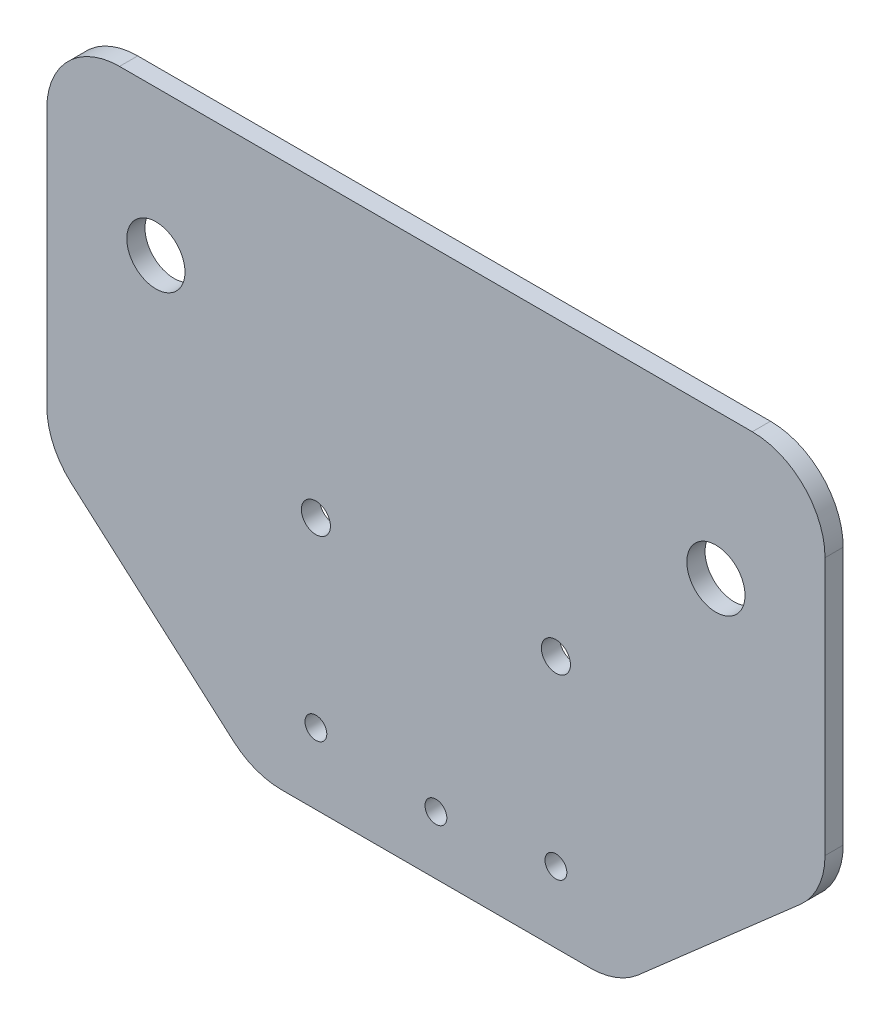
ISO-10303-21;
HEADER;
FILE_DESCRIPTION(('STEP AP214'),'2;1');
FILE_NAME('part.step','',(''),(''),'','','');
FILE_SCHEMA(('AUTOMOTIVE_DESIGN { 1 0 10303 214 1 1 1 1 }'));
ENDSEC;
DATA;
#1=APPLICATION_CONTEXT('core data for automotive mechanical design processes');
#2=APPLICATION_PROTOCOL_DEFINITION('international standard','automotive_design',2000,#1);
#3=PRODUCT_CONTEXT('',#1,'mechanical');
#4=PRODUCT('Part','Part','',(#3));
#5=PRODUCT_RELATED_PRODUCT_CATEGORY('part','',(#4));
#6=PRODUCT_DEFINITION_FORMATION('','',#4);
#7=PRODUCT_DEFINITION_CONTEXT('part definition',#1,'design');
#8=PRODUCT_DEFINITION('design','',#6,#7);
#9=PRODUCT_DEFINITION_SHAPE('','',#8);
#10=(LENGTH_UNIT() NAMED_UNIT(*) SI_UNIT(.MILLI.,.METRE.));
#11=(NAMED_UNIT(*) PLANE_ANGLE_UNIT() SI_UNIT($,.RADIAN.));
#12=(NAMED_UNIT(*) SI_UNIT($,.STERADIAN.) SOLID_ANGLE_UNIT());
#13=UNCERTAINTY_MEASURE_WITH_UNIT(LENGTH_MEASURE(1.E-05),#10,'distance_accuracy_value','');
#14=(GEOMETRIC_REPRESENTATION_CONTEXT(3) GLOBAL_UNCERTAINTY_ASSIGNED_CONTEXT((#13)) GLOBAL_UNIT_ASSIGNED_CONTEXT((#10,
#11,#12)) REPRESENTATION_CONTEXT('',''));
#15=CARTESIAN_POINT('',(0.,0.,0.));
#16=DIRECTION('',(0.,0.,1.));
#17=DIRECTION('',(1.,0.,0.));
#18=AXIS2_PLACEMENT_3D('',#15,#16,#17);
#19=CARTESIAN_POINT('',(-16.5,-2.74999999999998,1.25));
#20=DIRECTION('',(0.,0.,-1.));
#21=DIRECTION('',(-1.,0.,0.));
#22=AXIS2_PLACEMENT_3D('',#19,#20,#21);
#23=CYLINDRICAL_SURFACE('',#22,2.);
#24=CARTESIAN_POINT('',(-16.5,-2.74999999999998,1.25));
#25=DIRECTION('',(0.,0.,1.));
#26=DIRECTION('',(1.,0.,0.));
#27=AXIS2_PLACEMENT_3D('',#24,#25,#26);
#28=CIRCLE('',#27,2.);
#29=CARTESIAN_POINT('',(-14.5,-2.74999999999998,1.25));
#30=VERTEX_POINT('',#29);
#31=EDGE_CURVE('E261',#30,#30,#28,.T.);
#32=ORIENTED_EDGE('',*,*,#31,.T.);
#33=EDGE_LOOP('',(#32));
#34=FACE_BOUND('',#33,.T.);
#35=CARTESIAN_POINT('',(-16.5,-2.74999999999998,-1.25));
#36=DIRECTION('',(0.,0.,1.));
#37=DIRECTION('',(1.,0.,0.));
#38=AXIS2_PLACEMENT_3D('',#35,#36,#37);
#39=CIRCLE('',#38,2.);
#40=CARTESIAN_POINT('',(-14.5,-2.74999999999998,-1.25));
#41=VERTEX_POINT('',#40);
#42=EDGE_CURVE('E257',#41,#41,#39,.T.);
#43=ORIENTED_EDGE('',*,*,#42,.F.);
#44=EDGE_LOOP('',(#43));
#45=FACE_BOUND('',#44,.T.);
#46=ADVANCED_FACE('F119',(#34,#45),#23,.F.);
#47=CARTESIAN_POINT('',(38.5,17.5,1.25));
#48=DIRECTION('',(0.,0.,-1.));
#49=DIRECTION('',(-1.,0.,0.));
#50=AXIS2_PLACEMENT_3D('',#47,#48,#49);
#51=CYLINDRICAL_SURFACE('',#50,4.);
#52=CARTESIAN_POINT('',(38.5,17.5,1.25));
#53=DIRECTION('',(0.,0.,1.));
#54=DIRECTION('',(1.,0.,0.));
#55=AXIS2_PLACEMENT_3D('',#52,#53,#54);
#56=CIRCLE('',#55,4.);
#57=CARTESIAN_POINT('',(42.5,17.5,1.25));
#58=VERTEX_POINT('',#57);
#59=EDGE_CURVE('E327',#58,#58,#56,.F.);
#60=ORIENTED_EDGE('',*,*,#59,.F.);
#61=EDGE_LOOP('',(#60));
#62=FACE_BOUND('',#61,.T.);
#63=CARTESIAN_POINT('',(38.5,17.5,-1.25));
#64=DIRECTION('',(0.,0.,1.));
#65=DIRECTION('',(1.,0.,0.));
#66=AXIS2_PLACEMENT_3D('',#63,#64,#65);
#67=CIRCLE('',#66,4.);
#68=CARTESIAN_POINT('',(42.5,17.5,-1.25));
#69=VERTEX_POINT('',#68);
#70=EDGE_CURVE('E254',#69,#69,#67,.F.);
#71=ORIENTED_EDGE('',*,*,#70,.T.);
#72=EDGE_LOOP('',(#71));
#73=FACE_BOUND('',#72,.T.);
#74=ADVANCED_FACE('F408',(#62,#73),#51,.F.);
#75=CARTESIAN_POINT('',(-38.5,17.5,1.25));
#76=DIRECTION('',(0.,0.,-1.));
#77=DIRECTION('',(-1.,0.,0.));
#78=AXIS2_PLACEMENT_3D('',#75,#76,#77);
#79=CYLINDRICAL_SURFACE('',#78,4.);
#80=CARTESIAN_POINT('',(-38.5,17.5,1.25));
#81=DIRECTION('',(0.,0.,1.));
#82=DIRECTION('',(1.,0.,0.));
#83=AXIS2_PLACEMENT_3D('',#80,#81,#82);
#84=CIRCLE('',#83,4.);
#85=CARTESIAN_POINT('',(-34.5,17.5,1.25));
#86=VERTEX_POINT('',#85);
#87=EDGE_CURVE('E320',#86,#86,#84,.T.);
#88=ORIENTED_EDGE('',*,*,#87,.T.);
#89=EDGE_LOOP('',(#88));
#90=FACE_BOUND('',#89,.T.);
#91=CARTESIAN_POINT('',(-38.5,17.5,-1.25));
#92=DIRECTION('',(0.,0.,1.));
#93=DIRECTION('',(1.,0.,0.));
#94=AXIS2_PLACEMENT_3D('',#91,#92,#93);
#95=CIRCLE('',#94,4.);
#96=CARTESIAN_POINT('',(-34.5,17.5,-1.25));
#97=VERTEX_POINT('',#96);
#98=EDGE_CURVE('E251',#97,#97,#95,.T.);
#99=ORIENTED_EDGE('',*,*,#98,.F.);
#100=EDGE_LOOP('',(#99));
#101=FACE_BOUND('',#100,.T.);
#102=ADVANCED_FACE('F413',(#90,#101),#79,.F.);
#103=CARTESIAN_POINT('',(0.,37.5,1.25));
#104=DIRECTION('',(0.,-1.,0.));
#105=DIRECTION('',(1.,0.,0.));
#106=AXIS2_PLACEMENT_3D('',#103,#104,#105);
#107=PLANE('',#106);
#108=DIRECTION('',(-1.,0.,0.));
#109=VECTOR('',#108,1.);
#110=CARTESIAN_POINT('',(0.,37.5,-1.25));
#111=LINE('',#110,#109);
#112=CARTESIAN_POINT('',(43.5,37.5,-1.25));
#113=VERTEX_POINT('',#112);
#114=CARTESIAN_POINT('',(-43.5,37.5,-1.25));
#115=VERTEX_POINT('',#114);
#116=EDGE_CURVE('E237',#113,#115,#111,.T.);
#117=ORIENTED_EDGE('',*,*,#116,.T.);
#118=DIRECTION('',(0.,0.,-1.));
#119=VECTOR('',#118,1.);
#120=CARTESIAN_POINT('',(-43.5,37.5,1.25));
#121=LINE('',#120,#119);
#122=CARTESIAN_POINT('',(-43.5,37.5,1.25));
#123=VERTEX_POINT('',#122);
#124=EDGE_CURVE('E214',#115,#123,#121,.F.);
#125=ORIENTED_EDGE('',*,*,#124,.T.);
#126=DIRECTION('',(-1.,0.,0.));
#127=VECTOR('',#126,1.);
#128=CARTESIAN_POINT('',(0.,37.5,1.25));
#129=LINE('',#128,#127);
#130=CARTESIAN_POINT('',(43.5,37.5,1.25));
#131=VERTEX_POINT('',#130);
#132=EDGE_CURVE('E359',#131,#123,#129,.T.);
#133=ORIENTED_EDGE('',*,*,#132,.F.);
#134=DIRECTION('',(0.,0.,-1.));
#135=VECTOR('',#134,1.);
#136=CARTESIAN_POINT('',(43.5,37.5,-1.25));
#137=LINE('',#136,#135);
#138=EDGE_CURVE('E219',#131,#113,#137,.T.);
#139=ORIENTED_EDGE('',*,*,#138,.T.);
#140=EDGE_LOOP('',(#117,#125,#133,#139));
#141=FACE_BOUND('',#140,.T.);
#142=ADVANCED_FACE('F362',(#141),#107,.F.);
#143=CARTESIAN_POINT('',(-53.5,0.,1.25));
#144=DIRECTION('',(1.,0.,0.));
#145=DIRECTION('',(0.,1.,0.));
#146=AXIS2_PLACEMENT_3D('',#143,#144,#145);
#147=PLANE('',#146);
#148=DIRECTION('',(0.,-1.,0.));
#149=VECTOR('',#148,1.);
#150=CARTESIAN_POINT('',(-53.5,0.,1.25));
#151=LINE('',#150,#149);
#152=CARTESIAN_POINT('',(-53.5,27.5,1.25));
#153=VERTEX_POINT('',#152);
#154=CARTESIAN_POINT('',(-53.5,-7.96979642998782,1.25));
#155=VERTEX_POINT('',#154);
#156=EDGE_CURVE('E229',#153,#155,#151,.T.);
#157=ORIENTED_EDGE('',*,*,#156,.F.);
#158=DIRECTION('',(0.,0.,-1.));
#159=VECTOR('',#158,1.);
#160=CARTESIAN_POINT('',(-53.5,27.5,1.25));
#161=LINE('',#160,#159);
#162=CARTESIAN_POINT('',(-53.5,27.5,-1.25));
#163=VERTEX_POINT('',#162);
#164=EDGE_CURVE('E213',#153,#163,#161,.T.);
#165=ORIENTED_EDGE('',*,*,#164,.T.);
#166=DIRECTION('',(0.,-1.,0.));
#167=VECTOR('',#166,1.);
#168=CARTESIAN_POINT('',(-53.5,0.,-1.25));
#169=LINE('',#168,#167);
#170=CARTESIAN_POINT('',(-53.5,-7.96979642998782,-1.25));
#171=VERTEX_POINT('',#170);
#172=EDGE_CURVE('E226',#163,#171,#169,.T.);
#173=ORIENTED_EDGE('',*,*,#172,.T.);
#174=DIRECTION('',(0.,0.,-1.));
#175=VECTOR('',#174,1.);
#176=CARTESIAN_POINT('',(-53.5,-7.96979642998782,1.25));
#177=LINE('',#176,#175);
#178=EDGE_CURVE('E231',#171,#155,#177,.F.);
#179=ORIENTED_EDGE('',*,*,#178,.T.);
#180=EDGE_LOOP('',(#157,#165,#173,#179));
#181=FACE_BOUND('',#180,.T.);
#182=ADVANCED_FACE('F225',(#181),#147,.F.);
#183=CARTESIAN_POINT('',(-29.4616455035658,-33.586275874065,1.25));
#184=DIRECTION('',(0.659437818308136,0.751759112871275,0.));
#185=DIRECTION('',(-0.751759112871275,0.659437818308136,0.));
#186=AXIS2_PLACEMENT_3D('',#183,#184,#185);
#187=PLANE('',#186);
#188=DIRECTION('',(0.751759112871275,-0.659437818308136,0.));
#189=VECTOR('',#188,1.);
#190=CARTESIAN_POINT('',(-29.4616455035658,-33.586275874065,-1.25));
#191=LINE('',#190,#189);
#192=CARTESIAN_POINT('',(-50.0943781830813,-15.4873875587006,-1.25));
#193=VERTEX_POINT('',#192);
#194=CARTESIAN_POINT('',(-27.8299461132675,-35.0175911287127,-1.25));
#195=VERTEX_POINT('',#194);
#196=EDGE_CURVE('E236',#193,#195,#191,.T.);
#197=ORIENTED_EDGE('',*,*,#196,.T.);
#198=DIRECTION('',(0.,0.,-1.));
#199=VECTOR('',#198,1.);
#200=CARTESIAN_POINT('',(-27.8299461132675,-35.0175911287127,1.25));
#201=LINE('',#200,#199);
#202=CARTESIAN_POINT('',(-27.8299461132675,-35.0175911287127,1.25));
#203=VERTEX_POINT('',#202);
#204=EDGE_CURVE('E12',#195,#203,#201,.F.);
#205=ORIENTED_EDGE('',*,*,#204,.T.);
#206=DIRECTION('',(0.751759112871275,-0.659437818308136,0.));
#207=VECTOR('',#206,1.);
#208=CARTESIAN_POINT('',(-29.4616455035658,-33.586275874065,1.25));
#209=LINE('',#208,#207);
#210=CARTESIAN_POINT('',(-50.0943781830813,-15.4873875587006,1.25));
#211=VERTEX_POINT('',#210);
#212=EDGE_CURVE('E305',#211,#203,#209,.T.);
#213=ORIENTED_EDGE('',*,*,#212,.F.);
#214=DIRECTION('',(0.,0.,-1.));
#215=VECTOR('',#214,1.);
#216=CARTESIAN_POINT('',(-50.0943781830813,-15.4873875587006,1.25));
#217=LINE('',#216,#215);
#218=EDGE_CURVE('E127',#211,#193,#217,.T.);
#219=ORIENTED_EDGE('',*,*,#218,.T.);
#220=EDGE_LOOP('',(#197,#205,#213,#219));
#221=FACE_BOUND('',#220,.T.);
#222=ADVANCED_FACE('F302',(#221),#187,.F.);
#223=CARTESIAN_POINT('',(0.,-37.5,1.25));
#224=DIRECTION('',(0.,1.,0.));
#225=DIRECTION('',(-1.,0.,0.));
#226=AXIS2_PLACEMENT_3D('',#223,#224,#225);
#227=PLANE('',#226);
#228=DIRECTION('',(1.,0.,0.));
#229=VECTOR('',#228,1.);
#230=CARTESIAN_POINT('',(0.,-37.5,-1.25));
#231=LINE('',#230,#229);
#232=CARTESIAN_POINT('',(-21.2355679301861,-37.5,-1.25));
#233=VERTEX_POINT('',#232);
#234=CARTESIAN_POINT('',(21.2355679301861,-37.5,-1.25));
#235=VERTEX_POINT('',#234);
#236=EDGE_CURVE('E240',#233,#235,#231,.T.);
#237=ORIENTED_EDGE('',*,*,#236,.T.);
#238=DIRECTION('',(0.,0.,-1.));
#239=VECTOR('',#238,1.);
#240=CARTESIAN_POINT('',(21.2355679301861,-37.5,1.25));
#241=LINE('',#240,#239);
#242=CARTESIAN_POINT('',(21.2355679301861,-37.5,1.25));
#243=VERTEX_POINT('',#242);
#244=EDGE_CURVE('E297',#235,#243,#241,.F.);
#245=ORIENTED_EDGE('',*,*,#244,.T.);
#246=DIRECTION('',(1.,0.,0.));
#247=VECTOR('',#246,1.);
#248=CARTESIAN_POINT('',(0.,-37.5,1.25));
#249=LINE('',#248,#247);
#250=CARTESIAN_POINT('',(-21.2355679301861,-37.5,1.25));
#251=VERTEX_POINT('',#250);
#252=EDGE_CURVE('E317',#251,#243,#249,.T.);
#253=ORIENTED_EDGE('',*,*,#252,.F.);
#254=DIRECTION('',(0.,0.,-1.));
#255=VECTOR('',#254,1.);
#256=CARTESIAN_POINT('',(-21.2355679301861,-37.5,1.25));
#257=LINE('',#256,#255);
#258=EDGE_CURVE('E294',#251,#233,#257,.T.);
#259=ORIENTED_EDGE('',*,*,#258,.T.);
#260=EDGE_LOOP('',(#237,#245,#253,#259));
#261=FACE_BOUND('',#260,.T.);
#262=ADVANCED_FACE('F315',(#261),#227,.F.);
#263=CARTESIAN_POINT('',(29.4616455035658,-33.586275874065,1.25));
#264=DIRECTION('',(0.659437818308136,-0.751759112871275,0.));
#265=DIRECTION('',(0.751759112871275,0.659437818308136,0.));
#266=AXIS2_PLACEMENT_3D('',#263,#264,#265);
#267=PLANE('',#266);
#268=DIRECTION('',(-0.751759112871275,-0.659437818308136,0.));
#269=VECTOR('',#268,1.);
#270=CARTESIAN_POINT('',(29.4616455035658,-33.586275874065,-1.25));
#271=LINE('',#270,#269);
#272=CARTESIAN_POINT('',(50.0943781830814,-15.4873875587005,-1.25));
#273=VERTEX_POINT('',#272);
#274=CARTESIAN_POINT('',(27.8299461132675,-35.0175911287127,-1.25));
#275=VERTEX_POINT('',#274);
#276=EDGE_CURVE('E248',#273,#275,#271,.T.);
#277=ORIENTED_EDGE('',*,*,#276,.F.);
#278=DIRECTION('',(0.,0.,-1.));
#279=VECTOR('',#278,1.);
#280=CARTESIAN_POINT('',(50.0943781830814,-15.4873875587005,1.25));
#281=LINE('',#280,#279);
#282=CARTESIAN_POINT('',(50.0943781830814,-15.4873875587005,1.25));
#283=VERTEX_POINT('',#282);
#284=EDGE_CURVE('E141',#273,#283,#281,.F.);
#285=ORIENTED_EDGE('',*,*,#284,.T.);
#286=DIRECTION('',(-0.751759112871275,-0.659437818308136,0.));
#287=VECTOR('',#286,1.);
#288=CARTESIAN_POINT('',(29.4616455035658,-33.586275874065,1.25));
#289=LINE('',#288,#287);
#290=CARTESIAN_POINT('',(27.8299461132675,-35.0175911287127,1.25));
#291=VERTEX_POINT('',#290);
#292=EDGE_CURVE('E318',#283,#291,#289,.T.);
#293=ORIENTED_EDGE('',*,*,#292,.T.);
#294=DIRECTION('',(0.,0.,-1.));
#295=VECTOR('',#294,1.);
#296=CARTESIAN_POINT('',(27.8299461132675,-35.0175911287127,-1.25));
#297=LINE('',#296,#295);
#298=EDGE_CURVE('E290',#291,#275,#297,.T.);
#299=ORIENTED_EDGE('',*,*,#298,.T.);
#300=EDGE_LOOP('',(#277,#285,#293,#299));
#301=FACE_BOUND('',#300,.T.);
#302=ADVANCED_FACE('F421',(#301),#267,.T.);
#303=CARTESIAN_POINT('',(53.5,0.,1.25));
#304=DIRECTION('',(1.,0.,0.));
#305=DIRECTION('',(0.,1.,0.));
#306=AXIS2_PLACEMENT_3D('',#303,#304,#305);
#307=PLANE('',#306);
#308=DIRECTION('',(0.,-1.,0.));
#309=VECTOR('',#308,1.);
#310=CARTESIAN_POINT('',(53.5,0.,-1.25));
#311=LINE('',#310,#309);
#312=CARTESIAN_POINT('',(53.5,27.5,-1.25));
#313=VERTEX_POINT('',#312);
#314=CARTESIAN_POINT('',(53.5,-7.96979642998779,-1.25));
#315=VERTEX_POINT('',#314);
#316=EDGE_CURVE('E242',#313,#315,#311,.T.);
#317=ORIENTED_EDGE('',*,*,#316,.F.);
#318=DIRECTION('',(0.,0.,-1.));
#319=VECTOR('',#318,1.);
#320=CARTESIAN_POINT('',(53.5,27.5,1.25));
#321=LINE('',#320,#319);
#322=CARTESIAN_POINT('',(53.5,27.5,1.25));
#323=VERTEX_POINT('',#322);
#324=EDGE_CURVE('E288',#313,#323,#321,.F.);
#325=ORIENTED_EDGE('',*,*,#324,.T.);
#326=DIRECTION('',(0.,-1.,0.));
#327=VECTOR('',#326,1.);
#328=CARTESIAN_POINT('',(53.5,0.,1.25));
#329=LINE('',#328,#327);
#330=CARTESIAN_POINT('',(53.5,-7.96979642998779,1.25));
#331=VERTEX_POINT('',#330);
#332=EDGE_CURVE('E360',#323,#331,#329,.T.);
#333=ORIENTED_EDGE('',*,*,#332,.T.);
#334=DIRECTION('',(0.,0.,-1.));
#335=VECTOR('',#334,1.);
#336=CARTESIAN_POINT('',(53.5,-7.96979642998779,1.25));
#337=LINE('',#336,#335);
#338=EDGE_CURVE('E285',#331,#315,#337,.T.);
#339=ORIENTED_EDGE('',*,*,#338,.T.);
#340=EDGE_LOOP('',(#317,#325,#333,#339));
#341=FACE_BOUND('',#340,.T.);
#342=ADVANCED_FACE('F347',(#341),#307,.T.);
#343=CARTESIAN_POINT('',(0.,-29.5,1.25));
#344=DIRECTION('',(0.,0.,-1.));
#345=DIRECTION('',(-1.,0.,0.));
#346=AXIS2_PLACEMENT_3D('',#343,#344,#345);
#347=CYLINDRICAL_SURFACE('',#346,1.5);
#348=CARTESIAN_POINT('',(0.,-29.5,1.25));
#349=DIRECTION('',(0.,0.,1.));
#350=DIRECTION('',(1.,0.,0.));
#351=AXIS2_PLACEMENT_3D('',#348,#349,#350);
#352=CIRCLE('',#351,1.5);
#353=CARTESIAN_POINT('',(1.5,-29.5,1.25));
#354=VERTEX_POINT('',#353);
#355=EDGE_CURVE('E364',#354,#354,#352,.T.);
#356=ORIENTED_EDGE('',*,*,#355,.T.);
#357=EDGE_LOOP('',(#356));
#358=FACE_BOUND('',#357,.T.);
#359=CARTESIAN_POINT('',(0.,-29.5,-1.25));
#360=DIRECTION('',(0.,0.,1.));
#361=DIRECTION('',(1.,0.,0.));
#362=AXIS2_PLACEMENT_3D('',#359,#360,#361);
#363=CIRCLE('',#362,1.5);
#364=CARTESIAN_POINT('',(1.5,-29.5,-1.25));
#365=VERTEX_POINT('',#364);
#366=EDGE_CURVE('E341',#365,#365,#363,.T.);
#367=ORIENTED_EDGE('',*,*,#366,.F.);
#368=EDGE_LOOP('',(#367));
#369=FACE_BOUND('',#368,.T.);
#370=ADVANCED_FACE('F390',(#358,#369),#347,.F.);
#371=CARTESIAN_POINT('',(-16.5,-27.75,1.25));
#372=DIRECTION('',(0.,0.,-1.));
#373=DIRECTION('',(-1.,0.,0.));
#374=AXIS2_PLACEMENT_3D('',#371,#372,#373);
#375=CYLINDRICAL_SURFACE('',#374,1.5);
#376=CARTESIAN_POINT('',(-16.5,-27.75,1.25));
#377=DIRECTION('',(0.,0.,1.));
#378=DIRECTION('',(1.,0.,0.));
#379=AXIS2_PLACEMENT_3D('',#376,#377,#378);
#380=CIRCLE('',#379,1.5);
#381=CARTESIAN_POINT('',(-15.,-27.75,1.25));
#382=VERTEX_POINT('',#381);
#383=EDGE_CURVE('E369',#382,#382,#380,.T.);
#384=ORIENTED_EDGE('',*,*,#383,.T.);
#385=EDGE_LOOP('',(#384));
#386=FACE_BOUND('',#385,.T.);
#387=CARTESIAN_POINT('',(-16.5,-27.75,-1.25));
#388=DIRECTION('',(0.,0.,1.));
#389=DIRECTION('',(1.,0.,0.));
#390=AXIS2_PLACEMENT_3D('',#387,#388,#389);
#391=CIRCLE('',#390,1.5);
#392=CARTESIAN_POINT('',(-15.,-27.75,-1.25));
#393=VERTEX_POINT('',#392);
#394=EDGE_CURVE('E338',#393,#393,#391,.T.);
#395=ORIENTED_EDGE('',*,*,#394,.F.);
#396=EDGE_LOOP('',(#395));
#397=FACE_BOUND('',#396,.T.);
#398=ADVANCED_FACE('F393',(#386,#397),#375,.F.);
#399=CARTESIAN_POINT('',(16.5,-27.75,1.25));
#400=DIRECTION('',(0.,0.,-1.));
#401=DIRECTION('',(-1.,0.,0.));
#402=AXIS2_PLACEMENT_3D('',#399,#400,#401);
#403=CYLINDRICAL_SURFACE('',#402,1.5);
#404=CARTESIAN_POINT('',(16.5,-27.75,1.25));
#405=DIRECTION('',(0.,0.,1.));
#406=DIRECTION('',(1.,0.,0.));
#407=AXIS2_PLACEMENT_3D('',#404,#405,#406);
#408=CIRCLE('',#407,1.5);
#409=CARTESIAN_POINT('',(18.,-27.75,1.25));
#410=VERTEX_POINT('',#409);
#411=EDGE_CURVE('E372',#410,#410,#408,.F.);
#412=ORIENTED_EDGE('',*,*,#411,.F.);
#413=EDGE_LOOP('',(#412));
#414=FACE_BOUND('',#413,.T.);
#415=CARTESIAN_POINT('',(16.5,-27.75,-1.25));
#416=DIRECTION('',(0.,0.,1.));
#417=DIRECTION('',(1.,0.,0.));
#418=AXIS2_PLACEMENT_3D('',#415,#416,#417);
#419=CIRCLE('',#418,1.5);
#420=CARTESIAN_POINT('',(18.,-27.75,-1.25));
#421=VERTEX_POINT('',#420);
#422=EDGE_CURVE('E335',#421,#421,#419,.F.);
#423=ORIENTED_EDGE('',*,*,#422,.T.);
#424=EDGE_LOOP('',(#423));
#425=FACE_BOUND('',#424,.T.);
#426=ADVANCED_FACE('F403',(#414,#425),#403,.F.);
#427=CARTESIAN_POINT('',(16.5,-2.74999999999997,1.25));
#428=DIRECTION('',(0.,0.,-1.));
#429=DIRECTION('',(-1.,0.,0.));
#430=AXIS2_PLACEMENT_3D('',#427,#428,#429);
#431=CYLINDRICAL_SURFACE('',#430,2.);
#432=CARTESIAN_POINT('',(16.5,-2.74999999999997,1.25));
#433=DIRECTION('',(0.,0.,1.));
#434=DIRECTION('',(1.,0.,0.));
#435=AXIS2_PLACEMENT_3D('',#432,#433,#434);
#436=CIRCLE('',#435,2.);
#437=CARTESIAN_POINT('',(18.5,-2.74999999999997,1.25));
#438=VERTEX_POINT('',#437);
#439=EDGE_CURVE('E260',#438,#438,#436,.T.);
#440=ORIENTED_EDGE('',*,*,#439,.T.);
#441=EDGE_LOOP('',(#440));
#442=FACE_BOUND('',#441,.T.);
#443=CARTESIAN_POINT('',(16.5,-2.74999999999997,-1.25));
#444=DIRECTION('',(0.,0.,1.));
#445=DIRECTION('',(1.,0.,0.));
#446=AXIS2_PLACEMENT_3D('',#443,#444,#445);
#447=CIRCLE('',#446,2.);
#448=CARTESIAN_POINT('',(18.5,-2.74999999999997,-1.25));
#449=VERTEX_POINT('',#448);
#450=EDGE_CURVE('E332',#449,#449,#447,.T.);
#451=ORIENTED_EDGE('',*,*,#450,.F.);
#452=EDGE_LOOP('',(#451));
#453=FACE_BOUND('',#452,.T.);
#454=ADVANCED_FACE('F378',(#442,#453),#431,.F.);
#455=CARTESIAN_POINT('',(0.,0.,-1.25));
#456=DIRECTION('',(0.,0.,1.));
#457=DIRECTION('',(1.,0.,0.));
#458=AXIS2_PLACEMENT_3D('',#455,#456,#457);
#459=PLANE('',#458);
#460=ORIENTED_EDGE('',*,*,#450,.T.);
#461=EDGE_LOOP('',(#460));
#462=FACE_BOUND('',#461,.T.);
#463=ORIENTED_EDGE('',*,*,#422,.F.);
#464=EDGE_LOOP('',(#463));
#465=FACE_BOUND('',#464,.T.);
#466=ORIENTED_EDGE('',*,*,#394,.T.);
#467=EDGE_LOOP('',(#466));
#468=FACE_BOUND('',#467,.T.);
#469=ORIENTED_EDGE('',*,*,#366,.T.);
#470=EDGE_LOOP('',(#469));
#471=FACE_BOUND('',#470,.T.);
#472=ORIENTED_EDGE('',*,*,#172,.F.);
#473=CARTESIAN_POINT('',(-43.5,27.5,-1.25));
#474=DIRECTION('',(0.,0.,1.));
#475=DIRECTION('',(1.,0.,0.));
#476=AXIS2_PLACEMENT_3D('',#473,#474,#475);
#477=CIRCLE('',#476,10.);
#478=EDGE_CURVE('E209',#163,#115,#477,.F.);
#479=ORIENTED_EDGE('',*,*,#478,.T.);
#480=ORIENTED_EDGE('',*,*,#116,.F.);
#481=CARTESIAN_POINT('',(43.5,27.5,-1.25));
#482=DIRECTION('',(0.,0.,1.));
#483=DIRECTION('',(1.,0.,0.));
#484=AXIS2_PLACEMENT_3D('',#481,#482,#483);
#485=CIRCLE('',#484,10.);
#486=EDGE_CURVE('E220',#113,#313,#485,.F.);
#487=ORIENTED_EDGE('',*,*,#486,.T.);
#488=ORIENTED_EDGE('',*,*,#316,.T.);
#489=CARTESIAN_POINT('',(43.5,-7.9697964299878,-1.25));
#490=DIRECTION('',(0.,0.,1.));
#491=DIRECTION('',(1.,0.,0.));
#492=AXIS2_PLACEMENT_3D('',#489,#490,#491);
#493=CIRCLE('',#492,10.);
#494=EDGE_CURVE('E268',#315,#273,#493,.F.);
#495=ORIENTED_EDGE('',*,*,#494,.T.);
#496=ORIENTED_EDGE('',*,*,#276,.T.);
#497=CARTESIAN_POINT('',(21.2355679301861,-27.5,-1.25));
#498=DIRECTION('',(0.,0.,1.));
#499=DIRECTION('',(1.,0.,0.));
#500=AXIS2_PLACEMENT_3D('',#497,#498,#499);
#501=CIRCLE('',#500,10.);
#502=EDGE_CURVE('E266',#275,#235,#501,.F.);
#503=ORIENTED_EDGE('',*,*,#502,.T.);
#504=ORIENTED_EDGE('',*,*,#236,.F.);
#505=CARTESIAN_POINT('',(-21.2355679301861,-27.5,-1.25));
#506=DIRECTION('',(0.,0.,1.));
#507=DIRECTION('',(1.,0.,0.));
#508=AXIS2_PLACEMENT_3D('',#505,#506,#507);
#509=CIRCLE('',#508,10.);
#510=EDGE_CURVE('E264',#233,#195,#509,.F.);
#511=ORIENTED_EDGE('',*,*,#510,.T.);
#512=ORIENTED_EDGE('',*,*,#196,.F.);
#513=CARTESIAN_POINT('',(-43.5,-7.96979642998781,-1.25));
#514=DIRECTION('',(0.,0.,1.));
#515=DIRECTION('',(1.,0.,0.));
#516=AXIS2_PLACEMENT_3D('',#513,#514,#515);
#517=CIRCLE('',#516,10.);
#518=EDGE_CURVE('E230',#193,#171,#517,.F.);
#519=ORIENTED_EDGE('',*,*,#518,.T.);
#520=EDGE_LOOP('',(#472,#479,#480,#487,#488,#495,#496,#503,#504,#511,#512,#519));
#521=FACE_BOUND('',#520,.T.);
#522=ORIENTED_EDGE('',*,*,#98,.T.);
#523=EDGE_LOOP('',(#522));
#524=FACE_BOUND('',#523,.T.);
#525=ORIENTED_EDGE('',*,*,#70,.F.);
#526=EDGE_LOOP('',(#525));
#527=FACE_BOUND('',#526,.T.);
#528=ORIENTED_EDGE('',*,*,#42,.T.);
#529=EDGE_LOOP('',(#528));
#530=FACE_BOUND('',#529,.T.);
#531=ADVANCED_FACE('F233',(#462,#465,#468,#471,#521,#524,#527,#530),#459,.F.);
#532=CARTESIAN_POINT('',(0.,0.,1.25));
#533=DIRECTION('',(0.,0.,1.));
#534=DIRECTION('',(1.,0.,0.));
#535=AXIS2_PLACEMENT_3D('',#532,#533,#534);
#536=PLANE('',#535);
#537=ORIENTED_EDGE('',*,*,#439,.F.);
#538=EDGE_LOOP('',(#537));
#539=FACE_BOUND('',#538,.T.);
#540=ORIENTED_EDGE('',*,*,#411,.T.);
#541=EDGE_LOOP('',(#540));
#542=FACE_BOUND('',#541,.T.);
#543=ORIENTED_EDGE('',*,*,#383,.F.);
#544=EDGE_LOOP('',(#543));
#545=FACE_BOUND('',#544,.T.);
#546=ORIENTED_EDGE('',*,*,#355,.F.);
#547=EDGE_LOOP('',(#546));
#548=FACE_BOUND('',#547,.T.);
#549=ORIENTED_EDGE('',*,*,#132,.T.);
#550=CARTESIAN_POINT('',(-43.5,27.5,1.25));
#551=DIRECTION('',(0.,0.,1.));
#552=DIRECTION('',(1.,0.,0.));
#553=AXIS2_PLACEMENT_3D('',#550,#551,#552);
#554=CIRCLE('',#553,10.);
#555=EDGE_CURVE('E283',#123,#153,#554,.T.);
#556=ORIENTED_EDGE('',*,*,#555,.T.);
#557=ORIENTED_EDGE('',*,*,#156,.T.);
#558=CARTESIAN_POINT('',(-43.5,-7.96979642998781,1.25));
#559=DIRECTION('',(0.,0.,1.));
#560=DIRECTION('',(1.,0.,0.));
#561=AXIS2_PLACEMENT_3D('',#558,#559,#560);
#562=CIRCLE('',#561,10.);
#563=EDGE_CURVE('E274',#155,#211,#562,.T.);
#564=ORIENTED_EDGE('',*,*,#563,.T.);
#565=ORIENTED_EDGE('',*,*,#212,.T.);
#566=CARTESIAN_POINT('',(-21.2355679301861,-27.5,1.25));
#567=DIRECTION('',(0.,0.,1.));
#568=DIRECTION('',(1.,0.,0.));
#569=AXIS2_PLACEMENT_3D('',#566,#567,#568);
#570=CIRCLE('',#569,10.);
#571=EDGE_CURVE('E276',#203,#251,#570,.T.);
#572=ORIENTED_EDGE('',*,*,#571,.T.);
#573=ORIENTED_EDGE('',*,*,#252,.T.);
#574=CARTESIAN_POINT('',(21.2355679301861,-27.5,1.25));
#575=DIRECTION('',(0.,0.,1.));
#576=DIRECTION('',(1.,0.,0.));
#577=AXIS2_PLACEMENT_3D('',#574,#575,#576);
#578=CIRCLE('',#577,10.);
#579=EDGE_CURVE('E134',#243,#291,#578,.T.);
#580=ORIENTED_EDGE('',*,*,#579,.T.);
#581=ORIENTED_EDGE('',*,*,#292,.F.);
#582=CARTESIAN_POINT('',(43.5,-7.9697964299878,1.25));
#583=DIRECTION('',(0.,0.,1.));
#584=DIRECTION('',(1.,0.,0.));
#585=AXIS2_PLACEMENT_3D('',#582,#583,#584);
#586=CIRCLE('',#585,10.);
#587=EDGE_CURVE('E279',#283,#331,#586,.T.);
#588=ORIENTED_EDGE('',*,*,#587,.T.);
#589=ORIENTED_EDGE('',*,*,#332,.F.);
#590=CARTESIAN_POINT('',(43.5,27.5,1.25));
#591=DIRECTION('',(0.,0.,1.));
#592=DIRECTION('',(1.,0.,0.));
#593=AXIS2_PLACEMENT_3D('',#590,#591,#592);
#594=CIRCLE('',#593,10.);
#595=EDGE_CURVE('E281',#323,#131,#594,.T.);
#596=ORIENTED_EDGE('',*,*,#595,.T.);
#597=EDGE_LOOP('',(#549,#556,#557,#564,#565,#572,#573,#580,#581,#588,#589,#596));
#598=FACE_BOUND('',#597,.T.);
#599=ORIENTED_EDGE('',*,*,#87,.F.);
#600=EDGE_LOOP('',(#599));
#601=FACE_BOUND('',#600,.T.);
#602=ORIENTED_EDGE('',*,*,#59,.T.);
#603=EDGE_LOOP('',(#602));
#604=FACE_BOUND('',#603,.T.);
#605=ORIENTED_EDGE('',*,*,#31,.F.);
#606=EDGE_LOOP('',(#605));
#607=FACE_BOUND('',#606,.T.);
#608=ADVANCED_FACE('F357',(#539,#542,#545,#548,#598,#601,#604,#607),#536,.T.);
#609=CARTESIAN_POINT('',(-43.5,27.5,1.25));
#610=DIRECTION('',(0.,0.,-1.));
#611=DIRECTION('',(-1.,0.,0.));
#612=AXIS2_PLACEMENT_3D('',#609,#610,#611);
#613=CYLINDRICAL_SURFACE('',#612,10.);
#614=ORIENTED_EDGE('',*,*,#555,.F.);
#615=ORIENTED_EDGE('',*,*,#124,.F.);
#616=ORIENTED_EDGE('',*,*,#478,.F.);
#617=ORIENTED_EDGE('',*,*,#164,.F.);
#618=EDGE_LOOP('',(#614,#615,#616,#617));
#619=FACE_BOUND('',#618,.T.);
#620=ADVANCED_FACE('F212',(#619),#613,.T.);
#621=CARTESIAN_POINT('',(43.5,27.5,1.25));
#622=DIRECTION('',(0.,0.,1.));
#623=DIRECTION('',(1.,0.,0.));
#624=AXIS2_PLACEMENT_3D('',#621,#622,#623);
#625=CYLINDRICAL_SURFACE('',#624,10.);
#626=ORIENTED_EDGE('',*,*,#595,.F.);
#627=ORIENTED_EDGE('',*,*,#324,.F.);
#628=ORIENTED_EDGE('',*,*,#486,.F.);
#629=ORIENTED_EDGE('',*,*,#138,.F.);
#630=EDGE_LOOP('',(#626,#627,#628,#629));
#631=FACE_BOUND('',#630,.T.);
#632=ADVANCED_FACE('F353',(#631),#625,.T.);
#633=CARTESIAN_POINT('',(43.5,-7.9697964299878,1.25));
#634=DIRECTION('',(0.,0.,-1.));
#635=DIRECTION('',(-1.,0.,0.));
#636=AXIS2_PLACEMENT_3D('',#633,#634,#635);
#637=CYLINDRICAL_SURFACE('',#636,10.);
#638=ORIENTED_EDGE('',*,*,#587,.F.);
#639=ORIENTED_EDGE('',*,*,#284,.F.);
#640=ORIENTED_EDGE('',*,*,#494,.F.);
#641=ORIENTED_EDGE('',*,*,#338,.F.);
#642=EDGE_LOOP('',(#638,#639,#640,#641));
#643=FACE_BOUND('',#642,.T.);
#644=ADVANCED_FACE('F444',(#643),#637,.T.);
#645=CARTESIAN_POINT('',(21.2355679301861,-27.5,1.25));
#646=DIRECTION('',(0.,0.,1.));
#647=DIRECTION('',(1.,0.,0.));
#648=AXIS2_PLACEMENT_3D('',#645,#646,#647);
#649=CYLINDRICAL_SURFACE('',#648,10.);
#650=ORIENTED_EDGE('',*,*,#579,.F.);
#651=ORIENTED_EDGE('',*,*,#244,.F.);
#652=ORIENTED_EDGE('',*,*,#502,.F.);
#653=ORIENTED_EDGE('',*,*,#298,.F.);
#654=EDGE_LOOP('',(#650,#651,#652,#653));
#655=FACE_BOUND('',#654,.T.);
#656=ADVANCED_FACE('F447',(#655),#649,.T.);
#657=CARTESIAN_POINT('',(-21.2355679301861,-27.5,1.25));
#658=DIRECTION('',(0.,0.,-1.));
#659=DIRECTION('',(-1.,0.,0.));
#660=AXIS2_PLACEMENT_3D('',#657,#658,#659);
#661=CYLINDRICAL_SURFACE('',#660,10.);
#662=ORIENTED_EDGE('',*,*,#571,.F.);
#663=ORIENTED_EDGE('',*,*,#204,.F.);
#664=ORIENTED_EDGE('',*,*,#510,.F.);
#665=ORIENTED_EDGE('',*,*,#258,.F.);
#666=EDGE_LOOP('',(#662,#663,#664,#665));
#667=FACE_BOUND('',#666,.T.);
#668=ADVANCED_FACE('F312',(#667),#661,.T.);
#669=CARTESIAN_POINT('',(-43.5,-7.96979642998781,1.25));
#670=DIRECTION('',(0.,0.,-1.));
#671=DIRECTION('',(-1.,0.,0.));
#672=AXIS2_PLACEMENT_3D('',#669,#670,#671);
#673=CYLINDRICAL_SURFACE('',#672,10.);
#674=ORIENTED_EDGE('',*,*,#563,.F.);
#675=ORIENTED_EDGE('',*,*,#178,.F.);
#676=ORIENTED_EDGE('',*,*,#518,.F.);
#677=ORIENTED_EDGE('',*,*,#218,.F.);
#678=EDGE_LOOP('',(#674,#675,#676,#677));
#679=FACE_BOUND('',#678,.T.);
#680=ADVANCED_FACE('F121',(#679),#673,.T.);
#681=CLOSED_SHELL('',(#46,#74,#102,#142,#182,#222,#262,#302,#342,#370,#398,#426,#454,#531,#608,
#620,#632,#644,#656,#668,#680));
#682=MANIFOLD_SOLID_BREP('B2',#681);
#683=ADVANCED_BREP_SHAPE_REPRESENTATION('',(#18,#682),#14);
#684=SHAPE_DEFINITION_REPRESENTATION(#9,#683);
ENDSEC;
END-ISO-10303-21;
